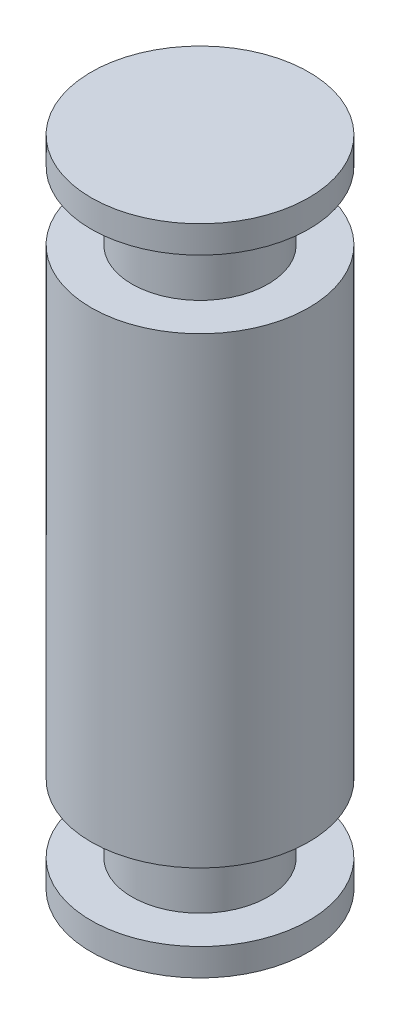
ISO-10303-21;
HEADER;
FILE_DESCRIPTION(('STEP AP214'),'2;1');
FILE_NAME('part.step','',(''),(''),'','','');
FILE_SCHEMA(('AUTOMOTIVE_DESIGN { 1 0 10303 214 1 1 1 1 }'));
ENDSEC;
DATA;
#1=APPLICATION_CONTEXT('core data for automotive mechanical design processes');
#2=APPLICATION_PROTOCOL_DEFINITION('international standard','automotive_design',2000,#1);
#3=PRODUCT_CONTEXT('',#1,'mechanical');
#4=PRODUCT('Part','Part','',(#3));
#5=PRODUCT_RELATED_PRODUCT_CATEGORY('part','',(#4));
#6=PRODUCT_DEFINITION_FORMATION('','',#4);
#7=PRODUCT_DEFINITION_CONTEXT('part definition',#1,'design');
#8=PRODUCT_DEFINITION('design','',#6,#7);
#9=PRODUCT_DEFINITION_SHAPE('','',#8);
#10=(LENGTH_UNIT() NAMED_UNIT(*) SI_UNIT(.MILLI.,.METRE.));
#11=(NAMED_UNIT(*) PLANE_ANGLE_UNIT() SI_UNIT($,.RADIAN.));
#12=(NAMED_UNIT(*) SI_UNIT($,.STERADIAN.) SOLID_ANGLE_UNIT());
#13=UNCERTAINTY_MEASURE_WITH_UNIT(LENGTH_MEASURE(1.E-05),#10,'distance_accuracy_value','');
#14=(GEOMETRIC_REPRESENTATION_CONTEXT(3) GLOBAL_UNCERTAINTY_ASSIGNED_CONTEXT((#13)) GLOBAL_UNIT_ASSIGNED_CONTEXT((#10,
#11,#12)) REPRESENTATION_CONTEXT('',''));
#15=CARTESIAN_POINT('',(0.,0.,0.));
#16=DIRECTION('',(0.,0.,1.));
#17=DIRECTION('',(1.,0.,0.));
#18=AXIS2_PLACEMENT_3D('',#15,#16,#17);
#19=CARTESIAN_POINT('',(0.,17.,0.));
#20=DIRECTION('',(0.,-1.,0.));
#21=DIRECTION('',(0.,0.,-1.));
#22=AXIS2_PLACEMENT_3D('',#19,#20,#21);
#23=CYLINDRICAL_SURFACE('',#22,4.);
#24=CARTESIAN_POINT('',(0.,17.,0.));
#25=DIRECTION('',(0.,1.,0.));
#26=DIRECTION('',(0.,0.,1.));
#27=AXIS2_PLACEMENT_3D('',#24,#25,#26);
#28=CIRCLE('',#27,4.);
#29=CARTESIAN_POINT('',(0.,17.,4.));
#30=VERTEX_POINT('',#29);
#31=EDGE_CURVE('E49',#30,#30,#28,.T.);
#32=ORIENTED_EDGE('',*,*,#31,.F.);
#33=EDGE_LOOP('',(#32));
#34=FACE_BOUND('',#33,.T.);
#35=CARTESIAN_POINT('',(0.,0.,0.));
#36=DIRECTION('',(0.,1.,0.));
#37=DIRECTION('',(0.,0.,1.));
#38=AXIS2_PLACEMENT_3D('',#35,#36,#37);
#39=CIRCLE('',#38,4.);
#40=CARTESIAN_POINT('',(0.,0.,4.));
#41=VERTEX_POINT('',#40);
#42=EDGE_CURVE('E40',#41,#41,#39,.T.);
#43=ORIENTED_EDGE('',*,*,#42,.T.);
#44=EDGE_LOOP('',(#43));
#45=FACE_BOUND('',#44,.T.);
#46=ADVANCED_FACE('F37',(#34,#45),#23,.T.);
#47=CARTESIAN_POINT('',(0.,17.,0.));
#48=DIRECTION('',(0.,1.,0.));
#49=DIRECTION('',(0.,0.,1.));
#50=AXIS2_PLACEMENT_3D('',#47,#48,#49);
#51=PLANE('',#50);
#52=CARTESIAN_POINT('',(0.,17.,0.));
#53=DIRECTION('',(0.,1.,0.));
#54=DIRECTION('',(0.,0.,1.));
#55=AXIS2_PLACEMENT_3D('',#52,#53,#54);
#56=CIRCLE('',#55,2.5);
#57=CARTESIAN_POINT('',(0.,17.,2.5));
#58=VERTEX_POINT('',#57);
#59=EDGE_CURVE('E10',#58,#58,#56,.T.);
#60=ORIENTED_EDGE('',*,*,#59,.F.);
#61=EDGE_LOOP('',(#60));
#62=FACE_BOUND('',#61,.T.);
#63=ORIENTED_EDGE('',*,*,#31,.T.);
#64=EDGE_LOOP('',(#63));
#65=FACE_BOUND('',#64,.T.);
#66=ADVANCED_FACE('F73',(#62,#65),#51,.T.);
#67=CARTESIAN_POINT('',(0.,0.,0.));
#68=DIRECTION('',(0.,1.,0.));
#69=DIRECTION('',(0.,0.,1.));
#70=AXIS2_PLACEMENT_3D('',#67,#68,#69);
#71=PLANE('',#70);
#72=CARTESIAN_POINT('',(0.,0.,0.));
#73=DIRECTION('',(0.,-1.,0.));
#74=DIRECTION('',(0.,0.,-1.));
#75=AXIS2_PLACEMENT_3D('',#72,#73,#74);
#76=CIRCLE('',#75,2.5);
#77=CARTESIAN_POINT('',(0.,0.,-2.5));
#78=VERTEX_POINT('',#77);
#79=EDGE_CURVE('E44',#78,#78,#76,.T.);
#80=ORIENTED_EDGE('',*,*,#79,.F.);
#81=EDGE_LOOP('',(#80));
#82=FACE_BOUND('',#81,.T.);
#83=ORIENTED_EDGE('',*,*,#42,.F.);
#84=EDGE_LOOP('',(#83));
#85=FACE_BOUND('',#84,.T.);
#86=ADVANCED_FACE('F70',(#82,#85),#71,.F.);
#87=CARTESIAN_POINT('',(0.,-2.5,0.));
#88=DIRECTION('',(0.,1.,0.));
#89=DIRECTION('',(0.,0.,1.));
#90=AXIS2_PLACEMENT_3D('',#87,#88,#89);
#91=CYLINDRICAL_SURFACE('',#90,2.5);
#92=CARTESIAN_POINT('',(0.,-2.5,0.));
#93=DIRECTION('',(0.,-1.,0.));
#94=DIRECTION('',(0.,0.,-1.));
#95=AXIS2_PLACEMENT_3D('',#92,#93,#94);
#96=CIRCLE('',#95,2.5);
#97=CARTESIAN_POINT('',(0.,-2.5,-2.5));
#98=VERTEX_POINT('',#97);
#99=EDGE_CURVE('E58',#98,#98,#96,.T.);
#100=ORIENTED_EDGE('',*,*,#99,.F.);
#101=EDGE_LOOP('',(#100));
#102=FACE_BOUND('',#101,.T.);
#103=ORIENTED_EDGE('',*,*,#79,.T.);
#104=EDGE_LOOP('',(#103));
#105=FACE_BOUND('',#104,.T.);
#106=ADVANCED_FACE('F72',(#102,#105),#91,.T.);
#107=CARTESIAN_POINT('',(0.,-3.5,0.));
#108=DIRECTION('',(0.,1.,0.));
#109=DIRECTION('',(0.,0.,1.));
#110=AXIS2_PLACEMENT_3D('',#107,#108,#109);
#111=CYLINDRICAL_SURFACE('',#110,4.);
#112=CARTESIAN_POINT('',(0.,-3.5,0.));
#113=DIRECTION('',(0.,-1.,0.));
#114=DIRECTION('',(0.,0.,-1.));
#115=AXIS2_PLACEMENT_3D('',#112,#113,#114);
#116=CIRCLE('',#115,4.);
#117=CARTESIAN_POINT('',(0.,-3.5,-4.));
#118=VERTEX_POINT('',#117);
#119=EDGE_CURVE('E55',#118,#118,#116,.T.);
#120=ORIENTED_EDGE('',*,*,#119,.F.);
#121=EDGE_LOOP('',(#120));
#122=FACE_BOUND('',#121,.T.);
#123=CARTESIAN_POINT('',(0.,-2.5,0.));
#124=DIRECTION('',(0.,-1.,0.));
#125=DIRECTION('',(0.,0.,-1.));
#126=AXIS2_PLACEMENT_3D('',#123,#124,#125);
#127=CIRCLE('',#126,4.);
#128=CARTESIAN_POINT('',(0.,-2.5,-4.));
#129=VERTEX_POINT('',#128);
#130=EDGE_CURVE('E59',#129,#129,#127,.T.);
#131=ORIENTED_EDGE('',*,*,#130,.T.);
#132=EDGE_LOOP('',(#131));
#133=FACE_BOUND('',#132,.T.);
#134=ADVANCED_FACE('F79',(#122,#133),#111,.T.);
#135=CARTESIAN_POINT('',(0.,-3.5,0.));
#136=DIRECTION('',(0.,-1.,0.));
#137=DIRECTION('',(0.,0.,-1.));
#138=AXIS2_PLACEMENT_3D('',#135,#136,#137);
#139=PLANE('',#138);
#140=ORIENTED_EDGE('',*,*,#119,.T.);
#141=EDGE_LOOP('',(#140));
#142=FACE_BOUND('',#141,.T.);
#143=ADVANCED_FACE('F147',(#142),#139,.T.);
#144=CARTESIAN_POINT('',(0.,-2.5,0.));
#145=DIRECTION('',(0.,-1.,0.));
#146=DIRECTION('',(0.,0.,-1.));
#147=AXIS2_PLACEMENT_3D('',#144,#145,#146);
#148=PLANE('',#147);
#149=ORIENTED_EDGE('',*,*,#99,.T.);
#150=EDGE_LOOP('',(#149));
#151=FACE_BOUND('',#150,.T.);
#152=ORIENTED_EDGE('',*,*,#130,.F.);
#153=EDGE_LOOP('',(#152));
#154=FACE_BOUND('',#153,.T.);
#155=ADVANCED_FACE('F100',(#151,#154),#148,.F.);
#156=CARTESIAN_POINT('',(0.,19.5,0.));
#157=DIRECTION('',(0.,-1.,0.));
#158=DIRECTION('',(0.,0.,-1.));
#159=AXIS2_PLACEMENT_3D('',#156,#157,#158);
#160=CYLINDRICAL_SURFACE('',#159,2.5);
#161=CARTESIAN_POINT('',(0.,19.5,0.));
#162=DIRECTION('',(0.,1.,0.));
#163=DIRECTION('',(0.,0.,1.));
#164=AXIS2_PLACEMENT_3D('',#161,#162,#163);
#165=CIRCLE('',#164,2.5);
#166=CARTESIAN_POINT('',(0.,19.5,2.5));
#167=VERTEX_POINT('',#166);
#168=EDGE_CURVE('E53',#167,#167,#165,.T.);
#169=ORIENTED_EDGE('',*,*,#168,.F.);
#170=EDGE_LOOP('',(#169));
#171=FACE_BOUND('',#170,.T.);
#172=ORIENTED_EDGE('',*,*,#59,.T.);
#173=EDGE_LOOP('',(#172));
#174=FACE_BOUND('',#173,.T.);
#175=ADVANCED_FACE('F105',(#171,#174),#160,.T.);
#176=CARTESIAN_POINT('',(0.,20.5,0.));
#177=DIRECTION('',(0.,-1.,0.));
#178=DIRECTION('',(0.,0.,-1.));
#179=AXIS2_PLACEMENT_3D('',#176,#177,#178);
#180=CYLINDRICAL_SURFACE('',#179,4.);
#181=CARTESIAN_POINT('',(0.,20.5,0.));
#182=DIRECTION('',(0.,1.,0.));
#183=DIRECTION('',(0.,0.,1.));
#184=AXIS2_PLACEMENT_3D('',#181,#182,#183);
#185=CIRCLE('',#184,4.);
#186=CARTESIAN_POINT('',(0.,20.5,4.));
#187=VERTEX_POINT('',#186);
#188=EDGE_CURVE('E189',#187,#187,#185,.T.);
#189=ORIENTED_EDGE('',*,*,#188,.F.);
#190=EDGE_LOOP('',(#189));
#191=FACE_BOUND('',#190,.T.);
#192=CARTESIAN_POINT('',(0.,19.5,0.));
#193=DIRECTION('',(0.,1.,0.));
#194=DIRECTION('',(0.,0.,1.));
#195=AXIS2_PLACEMENT_3D('',#192,#193,#194);
#196=CIRCLE('',#195,4.);
#197=CARTESIAN_POINT('',(0.,19.5,4.));
#198=VERTEX_POINT('',#197);
#199=EDGE_CURVE('E187',#198,#198,#196,.T.);
#200=ORIENTED_EDGE('',*,*,#199,.T.);
#201=EDGE_LOOP('',(#200));
#202=FACE_BOUND('',#201,.T.);
#203=ADVANCED_FACE('F110',(#191,#202),#180,.T.);
#204=CARTESIAN_POINT('',(0.,20.5,0.));
#205=DIRECTION('',(0.,1.,0.));
#206=DIRECTION('',(0.,0.,1.));
#207=AXIS2_PLACEMENT_3D('',#204,#205,#206);
#208=PLANE('',#207);
#209=ORIENTED_EDGE('',*,*,#188,.T.);
#210=EDGE_LOOP('',(#209));
#211=FACE_BOUND('',#210,.T.);
#212=ADVANCED_FACE('F120',(#211),#208,.T.);
#213=CARTESIAN_POINT('',(0.,19.5,0.));
#214=DIRECTION('',(0.,1.,0.));
#215=DIRECTION('',(0.,0.,1.));
#216=AXIS2_PLACEMENT_3D('',#213,#214,#215);
#217=PLANE('',#216);
#218=ORIENTED_EDGE('',*,*,#168,.T.);
#219=EDGE_LOOP('',(#218));
#220=FACE_BOUND('',#219,.T.);
#221=ORIENTED_EDGE('',*,*,#199,.F.);
#222=EDGE_LOOP('',(#221));
#223=FACE_BOUND('',#222,.T.);
#224=ADVANCED_FACE('F130',(#220,#223),#217,.F.);
#225=CLOSED_SHELL('',(#46,#66,#86,#106,#134,#143,#155,#175,#203,#212,#224));
#226=MANIFOLD_SOLID_BREP('B2',#225);
#227=ADVANCED_BREP_SHAPE_REPRESENTATION('',(#18,#226),#14);
#228=SHAPE_DEFINITION_REPRESENTATION(#9,#227);
ENDSEC;
END-ISO-10303-21;
